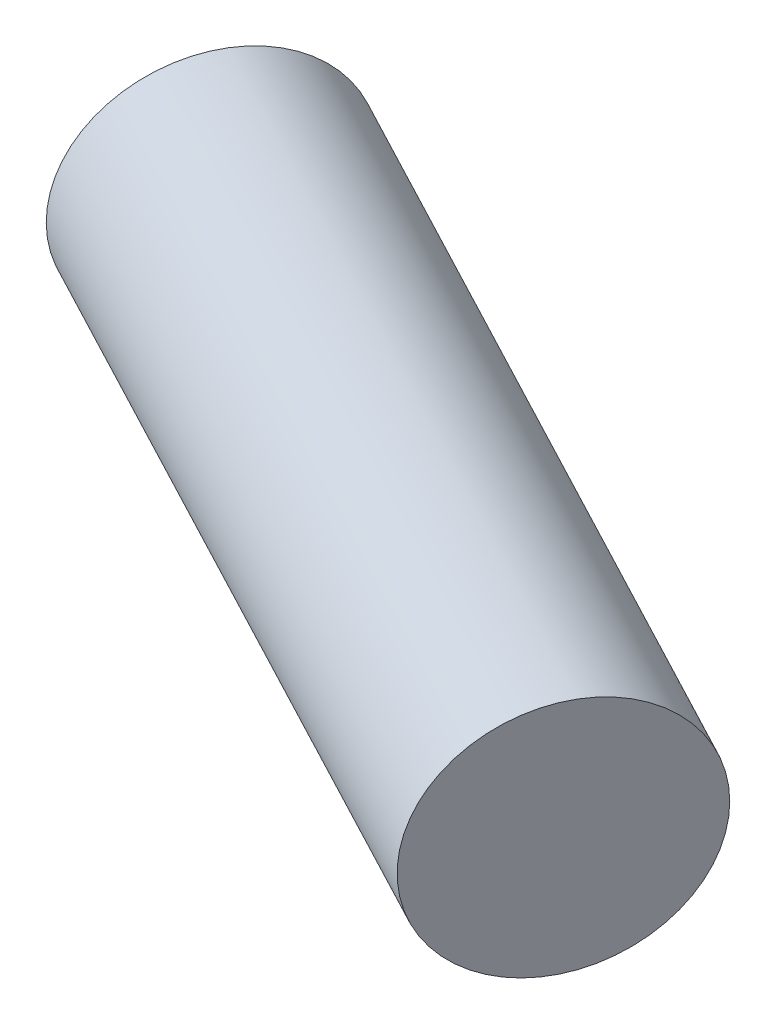
ISO-10303-21;
HEADER;
FILE_DESCRIPTION(('STEP AP214'),'2;1');
FILE_NAME('part.step','',(''),(''),'','','');
FILE_SCHEMA(('AUTOMOTIVE_DESIGN { 1 0 10303 214 1 1 1 1 }'));
ENDSEC;
DATA;
#1=APPLICATION_CONTEXT('core data for automotive mechanical design processes');
#2=APPLICATION_PROTOCOL_DEFINITION('international standard','automotive_design',2000,#1);
#3=PRODUCT_CONTEXT('',#1,'mechanical');
#4=PRODUCT('Part','Part','',(#3));
#5=PRODUCT_RELATED_PRODUCT_CATEGORY('part','',(#4));
#6=PRODUCT_DEFINITION_FORMATION('','',#4);
#7=PRODUCT_DEFINITION_CONTEXT('part definition',#1,'design');
#8=PRODUCT_DEFINITION('design','',#6,#7);
#9=PRODUCT_DEFINITION_SHAPE('','',#8);
#10=(LENGTH_UNIT() NAMED_UNIT(*) SI_UNIT(.MILLI.,.METRE.));
#11=(NAMED_UNIT(*) PLANE_ANGLE_UNIT() SI_UNIT($,.RADIAN.));
#12=(NAMED_UNIT(*) SI_UNIT($,.STERADIAN.) SOLID_ANGLE_UNIT());
#13=UNCERTAINTY_MEASURE_WITH_UNIT(LENGTH_MEASURE(1.E-05),#10,'distance_accuracy_value','');
#14=(GEOMETRIC_REPRESENTATION_CONTEXT(3) GLOBAL_UNCERTAINTY_ASSIGNED_CONTEXT((#13)) GLOBAL_UNIT_ASSIGNED_CONTEXT((#10,
#11,#12)) REPRESENTATION_CONTEXT('',''));
#15=CARTESIAN_POINT('',(0.,0.,0.));
#16=DIRECTION('',(0.,0.,1.));
#17=DIRECTION('',(1.,0.,0.));
#18=AXIS2_PLACEMENT_3D('',#15,#16,#17);
#19=CARTESIAN_POINT('',(29.4348149646132,71.4123021518042,-11.6178037219995));
#20=DIRECTION('',(-0.896176441510976,0.0682470658615711,-0.438417750190398));
#21=DIRECTION('',(-0.439442331545378,0.,0.898270803959453));
#22=AXIS2_PLACEMENT_3D('',#19,#20,#21);
#23=PLANE('',#22);
#24=CARTESIAN_POINT('',(29.4348149646132,71.4123021518042,-11.6178037219995));
#25=DIRECTION('',(-0.896176441510976,0.0682470658615708,-0.438417750190398));
#26=DIRECTION('',(0.271168006367878,0.866336498762443,-0.419438890941818));
#27=AXIS2_PLACEMENT_3D('',#24,#25,#26);
#28=CIRCLE('',#27,3.);
#29=CARTESIAN_POINT('',(30.7624757934493,71.6120184061194,-14.3006063873733));
#30=VERTEX_POINT('',#29);
#31=CARTESIAN_POINT('',(29.8631132611783,68.7387052975342,-12.9094849636364));
#32=VERTEX_POINT('',#31);
#33=EDGE_CURVE('E81',#30,#32,#28,.T.);
#34=ORIENTED_EDGE('',*,*,#33,.T.);
#35=DIRECTION('',(0.271168006367878,0.866336498762443,-0.419438890941818));
#36=VECTOR('',#35,1.);
#37=CARTESIAN_POINT('',(29.8631132611783,68.7387052975342,-12.9094849636364));
#38=LINE('',#37,#36);
#39=EDGE_CURVE('E11',#32,#30,#38,.T.);
#40=ORIENTED_EDGE('',*,*,#39,.T.);
#41=EDGE_LOOP('',(#34,#40));
#42=FACE_BOUND('',#41,.T.);
#43=ADVANCED_FACE('F17',(#42),#23,.T.);
#44=CARTESIAN_POINT('',(29.8631132611783,68.7387052975342,-12.9094849636364));
#45=DIRECTION('',(-0.351191825080246,0.49477611999097,0.794896781402144));
#46=DIRECTION('',(0.815460169920325,0.5788131920348,0.));
#47=AXIS2_PLACEMENT_3D('',#44,#45,#46);
#48=PLANE('',#47);
#49=DIRECTION('',(0.271168006367878,0.866336498762443,-0.419438890941818));
#50=VECTOR('',#49,1.);
#51=CARTESIAN_POINT('',(20.9013488460685,69.4211759561499,-17.2936624655404));
#52=LINE('',#51,#50);
#53=CARTESIAN_POINT('',(20.9013488460685,69.4211759561499,-17.2936624655404));
#54=VERTEX_POINT('',#53);
#55=CARTESIAN_POINT('',(21.8007113783395,72.2944890647351,-18.6847838892772));
#56=VERTEX_POINT('',#55);
#57=EDGE_CURVE('E27',#54,#56,#52,.T.);
#58=ORIENTED_EDGE('',*,*,#57,.T.);
#59=DIRECTION('',(-0.896176441510976,0.0682470658615711,-0.438417750190398));
#60=VECTOR('',#59,1.);
#61=CARTESIAN_POINT('',(30.7624757934493,71.6120184061194,-14.3006063873733));
#62=LINE('',#61,#60);
#63=EDGE_CURVE('E86',#30,#56,#62,.T.);
#64=ORIENTED_EDGE('',*,*,#63,.F.);
#65=ORIENTED_EDGE('',*,*,#39,.F.);
#66=DIRECTION('',(-0.896176441510976,0.0682470658615711,-0.438417750190398));
#67=VECTOR('',#66,1.);
#68=CARTESIAN_POINT('',(29.8631132611783,68.7387052975342,-12.9094849636364));
#69=LINE('',#68,#67);
#70=EDGE_CURVE('E77',#32,#54,#69,.T.);
#71=ORIENTED_EDGE('',*,*,#70,.T.);
#72=EDGE_LOOP('',(#58,#64,#65,#71));
#73=FACE_BOUND('',#72,.T.);
#74=ADVANCED_FACE('F97',(#73),#48,.F.);
#75=CARTESIAN_POINT('',(37.0523147174565,70.8322020919808,-7.89125284538109));
#76=DIRECTION('',(-0.896176441510976,0.0682470658615711,-0.438417750190398));
#77=DIRECTION('',(-0.439442331545378,0.,0.898270803959453));
#78=AXIS2_PLACEMENT_3D('',#75,#76,#77);
#79=PLANE('',#78);
#80=CARTESIAN_POINT('',(37.0523147174565,70.8322020919808,-7.89125284538109));
#81=DIRECTION('',(-0.896176441510976,0.0682470658615708,-0.438417750190398));
#82=DIRECTION('',(0.271168006367878,0.866336498762443,-0.419438890941818));
#83=AXIS2_PLACEMENT_3D('',#80,#81,#82);
#84=CIRCLE('',#83,3.);
#85=CARTESIAN_POINT('',(37.8658187365601,73.4312115882682,-9.14956951820655));
#86=VERTEX_POINT('',#85);
#87=EDGE_CURVE('E66',#86,#86,#84,.T.);
#88=ORIENTED_EDGE('',*,*,#87,.F.);
#89=EDGE_LOOP('',(#88));
#90=FACE_BOUND('',#89,.T.);
#91=ADVANCED_FACE('F106',(#90),#79,.F.);
#92=CARTESIAN_POINT('',(20.4730505495034,72.0947728104199,-16.0019812239035));
#93=DIRECTION('',(-0.896176441510976,0.0682470658615711,-0.438417750190398));
#94=DIRECTION('',(-0.439442331545378,0.,0.898270803959453));
#95=AXIS2_PLACEMENT_3D('',#92,#93,#94);
#96=PLANE('',#95);
#97=ORIENTED_EDGE('',*,*,#57,.F.);
#98=CARTESIAN_POINT('',(20.4730505495034,72.0947728104199,-16.0019812239035));
#99=DIRECTION('',(-0.896176441510976,0.0682470658615708,-0.438417750190398));
#100=DIRECTION('',(0.271168006367878,0.866336498762443,-0.419438890941818));
#101=AXIS2_PLACEMENT_3D('',#98,#99,#100);
#102=CIRCLE('',#101,3.);
#103=CARTESIAN_POINT('',(21.286554568607,74.6937823067072,-17.2602978967289));
#104=VERTEX_POINT('',#103);
#105=EDGE_CURVE('E75',#54,#104,#102,.T.);
#106=ORIENTED_EDGE('',*,*,#105,.T.);
#107=CARTESIAN_POINT('',(20.4730505495034,72.0947728104199,-16.0019812239035));
#108=DIRECTION('',(-0.896176441510976,0.0682470658615708,-0.438417750190398));
#109=DIRECTION('',(0.271168006367878,0.866336498762443,-0.419438890941818));
#110=AXIS2_PLACEMENT_3D('',#107,#108,#109);
#111=CIRCLE('',#110,3.);
#112=EDGE_CURVE('E20',#104,#56,#111,.T.);
#113=ORIENTED_EDGE('',*,*,#112,.T.);
#114=EDGE_LOOP('',(#97,#106,#113));
#115=FACE_BOUND('',#114,.T.);
#116=ADVANCED_FACE('F100',(#115),#96,.T.);
#117=CARTESIAN_POINT('',(20.4730505495034,72.0947728104199,-16.0019812239035));
#118=DIRECTION('',(0.896176441510976,-0.0682470658615708,0.438417750190398));
#119=DIRECTION('',(-0.271168006367878,-0.866336498762443,0.419438890941818));
#120=AXIS2_PLACEMENT_3D('',#117,#118,#119);
#121=CYLINDRICAL_SURFACE('',#120,3.);
#122=ORIENTED_EDGE('',*,*,#87,.T.);
#123=DIRECTION('',(-0.896176441510976,0.0682470658615711,-0.438417750190399));
#124=VECTOR('',#123,1.);
#125=CARTESIAN_POINT('',(21.286554568607,74.6937823067072,-17.2602978967289));
#126=LINE('',#125,#124);
#127=EDGE_CURVE('E64',#86,#104,#126,.T.);
#128=ORIENTED_EDGE('',*,*,#127,.T.);
#129=ORIENTED_EDGE('',*,*,#105,.F.);
#130=ORIENTED_EDGE('',*,*,#70,.F.);
#131=ORIENTED_EDGE('',*,*,#33,.F.);
#132=ORIENTED_EDGE('',*,*,#63,.T.);
#133=ORIENTED_EDGE('',*,*,#112,.F.);
#134=ORIENTED_EDGE('',*,*,#127,.F.);
#135=EDGE_LOOP('',(#122,#128,#129,#130,#131,#132,#133,#134));
#136=FACE_BOUND('',#135,.T.);
#137=ADVANCED_FACE('F63',(#136),#121,.T.);
#138=CLOSED_SHELL('',(#43,#74,#91,#116,#137));
#139=MANIFOLD_SOLID_BREP('B1',#138);
#140=ADVANCED_BREP_SHAPE_REPRESENTATION('',(#18,#139),#14);
#141=SHAPE_DEFINITION_REPRESENTATION(#9,#140);
ENDSEC;
END-ISO-10303-21;
